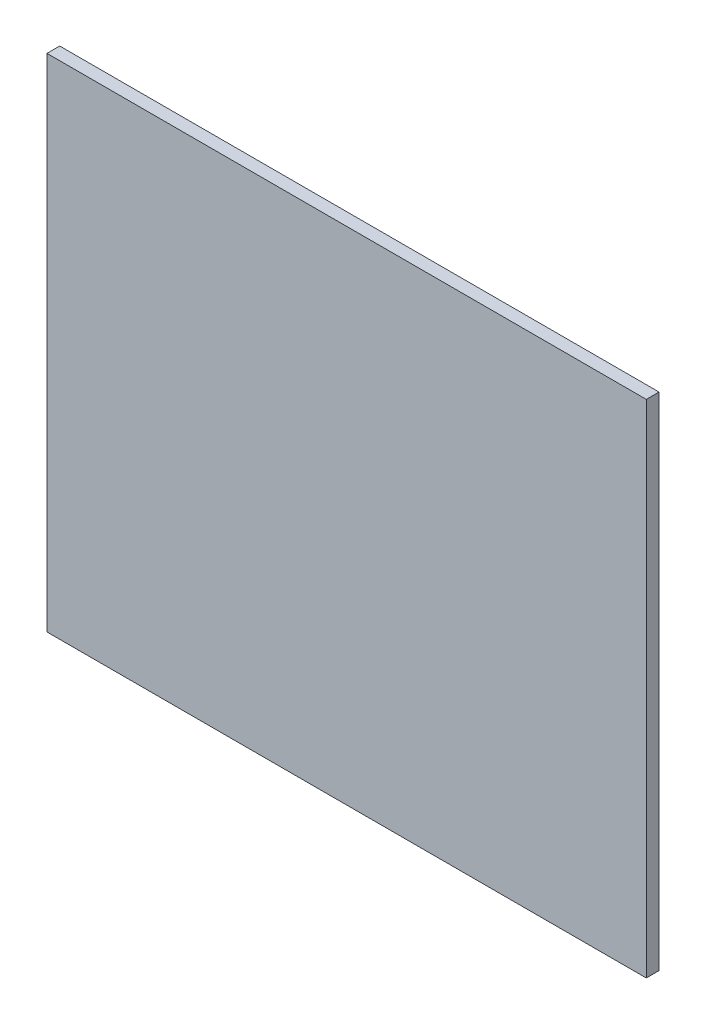
ISO-10303-21;
HEADER;
FILE_DESCRIPTION(('STEP AP214'),'2;1');
FILE_NAME('part.step','',(''),(''),'','','');
FILE_SCHEMA(('AUTOMOTIVE_DESIGN { 1 0 10303 214 1 1 1 1 }'));
ENDSEC;
DATA;
#1=APPLICATION_CONTEXT('core data for automotive mechanical design processes');
#2=APPLICATION_PROTOCOL_DEFINITION('international standard','automotive_design',2000,#1);
#3=PRODUCT_CONTEXT('',#1,'mechanical');
#4=PRODUCT('Part','Part','',(#3));
#5=PRODUCT_RELATED_PRODUCT_CATEGORY('part','',(#4));
#6=PRODUCT_DEFINITION_FORMATION('','',#4);
#7=PRODUCT_DEFINITION_CONTEXT('part definition',#1,'design');
#8=PRODUCT_DEFINITION('design','',#6,#7);
#9=PRODUCT_DEFINITION_SHAPE('','',#8);
#10=(LENGTH_UNIT() NAMED_UNIT(*) SI_UNIT(.MILLI.,.METRE.));
#11=(NAMED_UNIT(*) PLANE_ANGLE_UNIT() SI_UNIT($,.RADIAN.));
#12=(NAMED_UNIT(*) SI_UNIT($,.STERADIAN.) SOLID_ANGLE_UNIT());
#13=UNCERTAINTY_MEASURE_WITH_UNIT(LENGTH_MEASURE(1.E-05),#10,'distance_accuracy_value','');
#14=(GEOMETRIC_REPRESENTATION_CONTEXT(3) GLOBAL_UNCERTAINTY_ASSIGNED_CONTEXT((#13)) GLOBAL_UNIT_ASSIGNED_CONTEXT((#10,
#11,#12)) REPRESENTATION_CONTEXT('',''));
#15=CARTESIAN_POINT('',(0.,0.,0.));
#16=DIRECTION('',(0.,0.,1.));
#17=DIRECTION('',(1.,0.,0.));
#18=AXIS2_PLACEMENT_3D('',#15,#16,#17);
#19=CARTESIAN_POINT('',(0.,0.,0.5));
#20=DIRECTION('',(1.,0.,0.));
#21=DIRECTION('',(0.,0.,-1.));
#22=AXIS2_PLACEMENT_3D('',#19,#20,#21);
#23=PLANE('',#22);
#24=DIRECTION('',(0.,-1.,0.));
#25=VECTOR('',#24,1.);
#26=CARTESIAN_POINT('',(0.,0.,0.));
#27=LINE('',#26,#25);
#28=CARTESIAN_POINT('',(0.,19.65,0.));
#29=VERTEX_POINT('',#28);
#30=CARTESIAN_POINT('',(0.,0.,0.));
#31=VERTEX_POINT('',#30);
#32=EDGE_CURVE('E96',#29,#31,#27,.T.);
#33=ORIENTED_EDGE('',*,*,#32,.T.);
#34=DIRECTION('',(0.,0.,-1.));
#35=VECTOR('',#34,1.);
#36=CARTESIAN_POINT('',(0.,0.,0.5));
#37=LINE('',#36,#35);
#38=CARTESIAN_POINT('',(0.,0.,0.5));
#39=VERTEX_POINT('',#38);
#40=EDGE_CURVE('E11',#39,#31,#37,.T.);
#41=ORIENTED_EDGE('',*,*,#40,.F.);
#42=DIRECTION('',(0.,-1.,0.));
#43=VECTOR('',#42,1.);
#44=CARTESIAN_POINT('',(0.,0.,0.5));
#45=LINE('',#44,#43);
#46=CARTESIAN_POINT('',(0.,19.65,0.5));
#47=VERTEX_POINT('',#46);
#48=EDGE_CURVE('E84',#47,#39,#45,.T.);
#49=ORIENTED_EDGE('',*,*,#48,.F.);
#50=DIRECTION('',(0.,0.,-1.));
#51=VECTOR('',#50,1.);
#52=CARTESIAN_POINT('',(0.,19.65,0.5));
#53=LINE('',#52,#51);
#54=EDGE_CURVE('E92',#47,#29,#53,.T.);
#55=ORIENTED_EDGE('',*,*,#54,.T.);
#56=EDGE_LOOP('',(#33,#41,#49,#55));
#57=FACE_BOUND('',#56,.T.);
#58=ADVANCED_FACE('F33',(#57),#23,.F.);
#59=CARTESIAN_POINT('',(0.,0.,0.5));
#60=DIRECTION('',(0.,1.,0.));
#61=DIRECTION('',(0.,0.,1.));
#62=AXIS2_PLACEMENT_3D('',#59,#60,#61);
#63=PLANE('',#62);
#64=DIRECTION('',(1.,0.,0.));
#65=VECTOR('',#64,1.);
#66=CARTESIAN_POINT('',(0.,0.,0.));
#67=LINE('',#66,#65);
#68=CARTESIAN_POINT('',(23.5,0.,0.));
#69=VERTEX_POINT('',#68);
#70=EDGE_CURVE('E88',#31,#69,#67,.T.);
#71=ORIENTED_EDGE('',*,*,#70,.T.);
#72=DIRECTION('',(0.,0.,-1.));
#73=VECTOR('',#72,1.);
#74=CARTESIAN_POINT('',(23.5,0.,0.5));
#75=LINE('',#74,#73);
#76=CARTESIAN_POINT('',(23.5,0.,0.5));
#77=VERTEX_POINT('',#76);
#78=EDGE_CURVE('E41',#77,#69,#75,.T.);
#79=ORIENTED_EDGE('',*,*,#78,.F.);
#80=DIRECTION('',(1.,0.,0.));
#81=VECTOR('',#80,1.);
#82=CARTESIAN_POINT('',(0.,0.,0.5));
#83=LINE('',#82,#81);
#84=EDGE_CURVE('E79',#39,#77,#83,.T.);
#85=ORIENTED_EDGE('',*,*,#84,.F.);
#86=ORIENTED_EDGE('',*,*,#40,.T.);
#87=EDGE_LOOP('',(#71,#79,#85,#86));
#88=FACE_BOUND('',#87,.T.);
#89=ADVANCED_FACE('F87',(#88),#63,.F.);
#90=CARTESIAN_POINT('',(23.5,0.,0.5));
#91=DIRECTION('',(-1.,0.,0.));
#92=DIRECTION('',(0.,0.,1.));
#93=AXIS2_PLACEMENT_3D('',#90,#91,#92);
#94=PLANE('',#93);
#95=DIRECTION('',(0.,1.,0.));
#96=VECTOR('',#95,1.);
#97=CARTESIAN_POINT('',(23.5,0.,0.));
#98=LINE('',#97,#96);
#99=CARTESIAN_POINT('',(23.5,19.65,0.));
#100=VERTEX_POINT('',#99);
#101=EDGE_CURVE('E66',#69,#100,#98,.T.);
#102=ORIENTED_EDGE('',*,*,#101,.T.);
#103=DIRECTION('',(0.,0.,-1.));
#104=VECTOR('',#103,1.);
#105=CARTESIAN_POINT('',(23.5,19.65,0.5));
#106=LINE('',#105,#104);
#107=CARTESIAN_POINT('',(23.5,19.65,0.5));
#108=VERTEX_POINT('',#107);
#109=EDGE_CURVE('E89',#108,#100,#106,.T.);
#110=ORIENTED_EDGE('',*,*,#109,.F.);
#111=DIRECTION('',(0.,1.,0.));
#112=VECTOR('',#111,1.);
#113=CARTESIAN_POINT('',(23.5,0.,0.5));
#114=LINE('',#113,#112);
#115=EDGE_CURVE('E82',#77,#108,#114,.T.);
#116=ORIENTED_EDGE('',*,*,#115,.F.);
#117=ORIENTED_EDGE('',*,*,#78,.T.);
#118=EDGE_LOOP('',(#102,#110,#116,#117));
#119=FACE_BOUND('',#118,.T.);
#120=ADVANCED_FACE('F90',(#119),#94,.F.);
#121=CARTESIAN_POINT('',(0.,19.65,0.5));
#122=DIRECTION('',(0.,-1.,0.));
#123=DIRECTION('',(0.,0.,-1.));
#124=AXIS2_PLACEMENT_3D('',#121,#122,#123);
#125=PLANE('',#124);
#126=DIRECTION('',(-1.,0.,0.));
#127=VECTOR('',#126,1.);
#128=CARTESIAN_POINT('',(0.,19.65,0.));
#129=LINE('',#128,#127);
#130=EDGE_CURVE('E72',#100,#29,#129,.T.);
#131=ORIENTED_EDGE('',*,*,#130,.T.);
#132=ORIENTED_EDGE('',*,*,#54,.F.);
#133=DIRECTION('',(-1.,0.,0.));
#134=VECTOR('',#133,1.);
#135=CARTESIAN_POINT('',(0.,19.65,0.5));
#136=LINE('',#135,#134);
#137=EDGE_CURVE('E49',#108,#47,#136,.T.);
#138=ORIENTED_EDGE('',*,*,#137,.F.);
#139=ORIENTED_EDGE('',*,*,#109,.T.);
#140=EDGE_LOOP('',(#131,#132,#138,#139));
#141=FACE_BOUND('',#140,.T.);
#142=ADVANCED_FACE('F103',(#141),#125,.F.);
#143=CARTESIAN_POINT('',(0.,0.,0.5));
#144=DIRECTION('',(0.,0.,-1.));
#145=DIRECTION('',(-1.,0.,0.));
#146=AXIS2_PLACEMENT_3D('',#143,#144,#145);
#147=PLANE('',#146);
#148=ORIENTED_EDGE('',*,*,#48,.T.);
#149=ORIENTED_EDGE('',*,*,#84,.T.);
#150=ORIENTED_EDGE('',*,*,#115,.T.);
#151=ORIENTED_EDGE('',*,*,#137,.T.);
#152=EDGE_LOOP('',(#148,#149,#150,#151));
#153=FACE_BOUND('',#152,.T.);
#154=ADVANCED_FACE('F80',(#153),#147,.F.);
#155=CARTESIAN_POINT('',(0.,0.,0.));
#156=DIRECTION('',(0.,0.,-1.));
#157=DIRECTION('',(-1.,0.,0.));
#158=AXIS2_PLACEMENT_3D('',#155,#156,#157);
#159=PLANE('',#158);
#160=ORIENTED_EDGE('',*,*,#32,.F.);
#161=ORIENTED_EDGE('',*,*,#130,.F.);
#162=ORIENTED_EDGE('',*,*,#101,.F.);
#163=ORIENTED_EDGE('',*,*,#70,.F.);
#164=EDGE_LOOP('',(#160,#161,#162,#163));
#165=FACE_BOUND('',#164,.T.);
#166=ADVANCED_FACE('F106',(#165),#159,.T.);
#167=CLOSED_SHELL('',(#58,#89,#120,#142,#154,#166));
#168=MANIFOLD_SOLID_BREP('B2',#167);
#169=ADVANCED_BREP_SHAPE_REPRESENTATION('',(#18,#168),#14);
#170=SHAPE_DEFINITION_REPRESENTATION(#9,#169);
ENDSEC;
END-ISO-10303-21;
